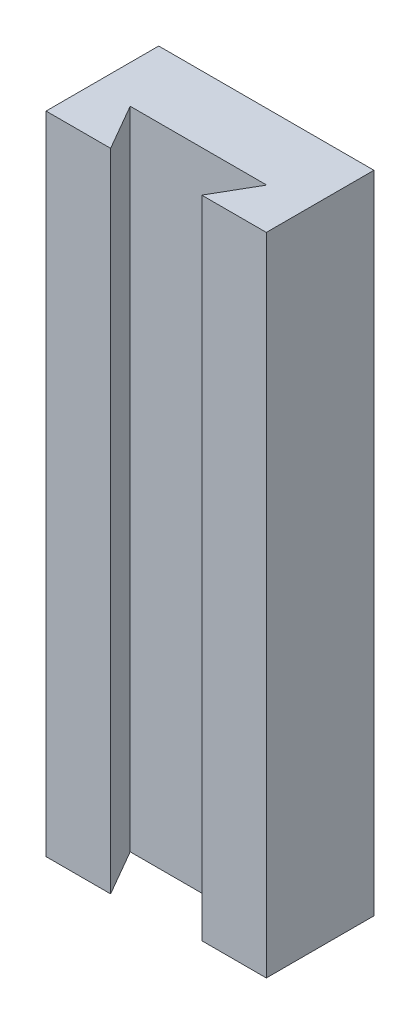
ISO-10303-21;
HEADER;
FILE_DESCRIPTION(('STEP AP214'),'2;1');
FILE_NAME('part.step','',(''),(''),'','','');
FILE_SCHEMA(('AUTOMOTIVE_DESIGN { 1 0 10303 214 1 1 1 1 }'));
ENDSEC;
DATA;
#1=APPLICATION_CONTEXT('core data for automotive mechanical design processes');
#2=APPLICATION_PROTOCOL_DEFINITION('international standard','automotive_design',2000,#1);
#3=PRODUCT_CONTEXT('',#1,'mechanical');
#4=PRODUCT('Part','Part','',(#3));
#5=PRODUCT_RELATED_PRODUCT_CATEGORY('part','',(#4));
#6=PRODUCT_DEFINITION_FORMATION('','',#4);
#7=PRODUCT_DEFINITION_CONTEXT('part definition',#1,'design');
#8=PRODUCT_DEFINITION('design','',#6,#7);
#9=PRODUCT_DEFINITION_SHAPE('','',#8);
#10=(LENGTH_UNIT() NAMED_UNIT(*) SI_UNIT(.MILLI.,.METRE.));
#11=(NAMED_UNIT(*) PLANE_ANGLE_UNIT() SI_UNIT($,.RADIAN.));
#12=(NAMED_UNIT(*) SI_UNIT($,.STERADIAN.) SOLID_ANGLE_UNIT());
#13=UNCERTAINTY_MEASURE_WITH_UNIT(LENGTH_MEASURE(1.E-05),#10,'distance_accuracy_value','');
#14=(GEOMETRIC_REPRESENTATION_CONTEXT(3) GLOBAL_UNCERTAINTY_ASSIGNED_CONTEXT((#13)) GLOBAL_UNIT_ASSIGNED_CONTEXT((#10,
#11,#12)) REPRESENTATION_CONTEXT('',''));
#15=CARTESIAN_POINT('',(0.,0.,0.));
#16=DIRECTION('',(0.,0.,1.));
#17=DIRECTION('',(1.,0.,0.));
#18=AXIS2_PLACEMENT_3D('',#15,#16,#17);
#19=CARTESIAN_POINT('',(-5.,-0.00999999999999959,0.234054964457145));
#20=DIRECTION('',(0.,0.,-1.));
#21=DIRECTION('',(-1.,0.,0.));
#22=AXIS2_PLACEMENT_3D('',#19,#20,#21);
#23=PLANE('',#22);
#24=DIRECTION('',(0.,1.,0.));
#25=VECTOR('',#24,1.);
#26=CARTESIAN_POINT('',(-2.,-0.00999999999999959,0.234054964457145));
#27=LINE('',#26,#25);
#28=CARTESIAN_POINT('',(-2.,0.,0.234054964457145));
#29=VERTEX_POINT('',#28);
#30=CARTESIAN_POINT('',(-2.,30.,0.234054964457145));
#31=VERTEX_POINT('',#30);
#32=EDGE_CURVE('E11',#29,#31,#27,.T.);
#33=ORIENTED_EDGE('',*,*,#32,.T.);
#34=DIRECTION('',(-1.,0.,0.));
#35=VECTOR('',#34,1.);
#36=CARTESIAN_POINT('',(0.,30.,0.234054964457145));
#37=LINE('',#36,#35);
#38=CARTESIAN_POINT('',(-5.,30.,0.234054964457145));
#39=VERTEX_POINT('',#38);
#40=EDGE_CURVE('E150',#31,#39,#37,.T.);
#41=ORIENTED_EDGE('',*,*,#40,.T.);
#42=DIRECTION('',(0.,1.,0.));
#43=VECTOR('',#42,1.);
#44=CARTESIAN_POINT('',(-5.,30.,0.234054964457145));
#45=LINE('',#44,#43);
#46=CARTESIAN_POINT('',(-5.,0.,0.234054964457145));
#47=VERTEX_POINT('',#46);
#48=EDGE_CURVE('E149',#47,#39,#45,.T.);
#49=ORIENTED_EDGE('',*,*,#48,.F.);
#50=DIRECTION('',(-1.,0.,0.));
#51=VECTOR('',#50,1.);
#52=CARTESIAN_POINT('',(0.,0.,0.234054964457145));
#53=LINE('',#52,#51);
#54=EDGE_CURVE('E57',#29,#47,#53,.T.);
#55=ORIENTED_EDGE('',*,*,#54,.F.);
#56=EDGE_LOOP('',(#33,#41,#49,#55));
#57=FACE_BOUND('',#56,.T.);
#58=ADVANCED_FACE('F43',(#57),#23,.F.);
#59=CARTESIAN_POINT('',(-2.,-0.00999999999999959,0.234054964457145));
#60=DIRECTION('',(-0.866025403784436,0.,0.500000000000004));
#61=DIRECTION('',(0.500000000000004,0.,0.866025403784436));
#62=AXIS2_PLACEMENT_3D('',#59,#60,#61);
#63=PLANE('',#62);
#64=DIRECTION('',(0.,1.,0.));
#65=VECTOR('',#64,1.);
#66=CARTESIAN_POINT('',(-3.2399584674678,-0.00999999999999959,-1.9136161004723));
#67=LINE('',#66,#65);
#68=CARTESIAN_POINT('',(-3.2399584674678,0.,-1.9136161004723));
#69=VERTEX_POINT('',#68);
#70=CARTESIAN_POINT('',(-3.2399584674678,30.,-1.9136161004723));
#71=VERTEX_POINT('',#70);
#72=EDGE_CURVE('E51',#69,#71,#67,.T.);
#73=ORIENTED_EDGE('',*,*,#72,.T.);
#74=DIRECTION('',(0.500000000000004,0.,0.866025403784436));
#75=VECTOR('',#74,1.);
#76=CARTESIAN_POINT('',(-1.60134877255087,30.,0.924539144898731));
#77=LINE('',#76,#75);
#78=EDGE_CURVE('E154',#71,#31,#77,.T.);
#79=ORIENTED_EDGE('',*,*,#78,.T.);
#80=ORIENTED_EDGE('',*,*,#32,.F.);
#81=DIRECTION('',(0.500000000000004,0.,0.866025403784436));
#82=VECTOR('',#81,1.);
#83=CARTESIAN_POINT('',(-1.60134877255087,0.,0.924539144898731));
#84=LINE('',#83,#82);
#85=EDGE_CURVE('E64',#69,#29,#84,.T.);
#86=ORIENTED_EDGE('',*,*,#85,.F.);
#87=EDGE_LOOP('',(#73,#79,#80,#86));
#88=FACE_BOUND('',#87,.T.);
#89=ADVANCED_FACE('F172',(#88),#63,.F.);
#90=CARTESIAN_POINT('',(-3.2399584674678,-0.00999999999999959,-1.9136161004723));
#91=DIRECTION('',(0.,0.,-1.));
#92=DIRECTION('',(-1.,0.,0.));
#93=AXIS2_PLACEMENT_3D('',#90,#91,#92);
#94=PLANE('',#93);
#95=DIRECTION('',(0.,1.,0.));
#96=VECTOR('',#95,1.);
#97=CARTESIAN_POINT('',(3.1048267707333,-0.00999999999999959,-1.9136161004723));
#98=LINE('',#97,#96);
#99=CARTESIAN_POINT('',(3.1048267707333,0.,-1.9136161004723));
#100=VERTEX_POINT('',#99);
#101=CARTESIAN_POINT('',(3.1048267707333,30.,-1.9136161004723));
#102=VERTEX_POINT('',#101);
#103=EDGE_CURVE('E169',#100,#102,#98,.T.);
#104=ORIENTED_EDGE('',*,*,#103,.T.);
#105=DIRECTION('',(-1.,0.,0.));
#106=VECTOR('',#105,1.);
#107=CARTESIAN_POINT('',(0.,30.,-1.9136161004723));
#108=LINE('',#107,#106);
#109=EDGE_CURVE('E157',#102,#71,#108,.T.);
#110=ORIENTED_EDGE('',*,*,#109,.T.);
#111=ORIENTED_EDGE('',*,*,#72,.F.);
#112=DIRECTION('',(-1.,0.,0.));
#113=VECTOR('',#112,1.);
#114=CARTESIAN_POINT('',(0.,0.,-1.9136161004723));
#115=LINE('',#114,#113);
#116=EDGE_CURVE('E141',#100,#69,#115,.T.);
#117=ORIENTED_EDGE('',*,*,#116,.F.);
#118=EDGE_LOOP('',(#104,#110,#111,#117));
#119=FACE_BOUND('',#118,.T.);
#120=ADVANCED_FACE('F174',(#119),#94,.F.);
#121=CARTESIAN_POINT('',(3.1048267707333,-0.00999999999999959,-1.9136161004723));
#122=DIRECTION('',(0.866025403784436,0.,0.500000000000004));
#123=DIRECTION('',(0.500000000000004,0.,-0.866025403784436));
#124=AXIS2_PLACEMENT_3D('',#121,#122,#123);
#125=PLANE('',#124);
#126=DIRECTION('',(0.,1.,0.));
#127=VECTOR('',#126,1.);
#128=CARTESIAN_POINT('',(2.,-0.00999999999999959,0.));
#129=LINE('',#128,#127);
#130=CARTESIAN_POINT('',(2.,0.,0.));
#131=VERTEX_POINT('',#130);
#132=CARTESIAN_POINT('',(2.,30.,0.));
#133=VERTEX_POINT('',#132);
#134=EDGE_CURVE('E153',#131,#133,#129,.T.);
#135=ORIENTED_EDGE('',*,*,#134,.T.);
#136=DIRECTION('',(0.500000000000004,0.,-0.866025403784436));
#137=VECTOR('',#136,1.);
#138=CARTESIAN_POINT('',(1.49999999999999,30.,0.866025403784443));
#139=LINE('',#138,#137);
#140=EDGE_CURVE('E160',#133,#102,#139,.T.);
#141=ORIENTED_EDGE('',*,*,#140,.T.);
#142=ORIENTED_EDGE('',*,*,#103,.F.);
#143=DIRECTION('',(0.500000000000004,0.,-0.866025403784436));
#144=VECTOR('',#143,1.);
#145=CARTESIAN_POINT('',(1.49999999999999,0.,0.866025403784443));
#146=LINE('',#145,#144);
#147=EDGE_CURVE('E143',#131,#100,#146,.T.);
#148=ORIENTED_EDGE('',*,*,#147,.F.);
#149=EDGE_LOOP('',(#135,#141,#142,#148));
#150=FACE_BOUND('',#149,.T.);
#151=ADVANCED_FACE('F187',(#150),#125,.F.);
#152=CARTESIAN_POINT('',(2.,-0.00999999999999959,0.));
#153=DIRECTION('',(0.,0.,-1.));
#154=DIRECTION('',(-1.,0.,0.));
#155=AXIS2_PLACEMENT_3D('',#152,#153,#154);
#156=PLANE('',#155);
#157=DIRECTION('',(0.,-1.,0.));
#158=VECTOR('',#157,1.);
#159=CARTESIAN_POINT('',(5.,30.,0.));
#160=LINE('',#159,#158);
#161=CARTESIAN_POINT('',(5.,30.,0.));
#162=VERTEX_POINT('',#161);
#163=CARTESIAN_POINT('',(5.,0.,0.));
#164=VERTEX_POINT('',#163);
#165=EDGE_CURVE('E164',#162,#164,#160,.T.);
#166=ORIENTED_EDGE('',*,*,#165,.F.);
#167=DIRECTION('',(-1.,0.,0.));
#168=VECTOR('',#167,1.);
#169=CARTESIAN_POINT('',(0.,30.,0.));
#170=LINE('',#169,#168);
#171=EDGE_CURVE('E115',#162,#133,#170,.T.);
#172=ORIENTED_EDGE('',*,*,#171,.T.);
#173=ORIENTED_EDGE('',*,*,#134,.F.);
#174=DIRECTION('',(-1.,0.,0.));
#175=VECTOR('',#174,1.);
#176=CARTESIAN_POINT('',(0.,0.,0.));
#177=LINE('',#176,#175);
#178=EDGE_CURVE('E146',#164,#131,#177,.T.);
#179=ORIENTED_EDGE('',*,*,#178,.F.);
#180=EDGE_LOOP('',(#166,#172,#173,#179));
#181=FACE_BOUND('',#180,.T.);
#182=ADVANCED_FACE('F45',(#181),#156,.F.);
#183=CARTESIAN_POINT('',(-5.,30.,-5.));
#184=DIRECTION('',(0.,0.,1.));
#185=DIRECTION('',(1.,0.,0.));
#186=AXIS2_PLACEMENT_3D('',#183,#184,#185);
#187=PLANE('',#186);
#188=DIRECTION('',(-1.,0.,0.));
#189=VECTOR('',#188,1.);
#190=CARTESIAN_POINT('',(-5.,0.,-5.));
#191=LINE('',#190,#189);
#192=CARTESIAN_POINT('',(5.,0.,-5.));
#193=VERTEX_POINT('',#192);
#194=CARTESIAN_POINT('',(-5.,0.,-5.));
#195=VERTEX_POINT('',#194);
#196=EDGE_CURVE('E198',#193,#195,#191,.T.);
#197=ORIENTED_EDGE('',*,*,#196,.T.);
#198=DIRECTION('',(0.,-1.,0.));
#199=VECTOR('',#198,1.);
#200=CARTESIAN_POINT('',(-5.,30.,-5.));
#201=LINE('',#200,#199);
#202=CARTESIAN_POINT('',(-5.,30.,-5.));
#203=VERTEX_POINT('',#202);
#204=EDGE_CURVE('E127',#203,#195,#201,.T.);
#205=ORIENTED_EDGE('',*,*,#204,.F.);
#206=DIRECTION('',(-1.,0.,0.));
#207=VECTOR('',#206,1.);
#208=CARTESIAN_POINT('',(-5.,30.,-5.));
#209=LINE('',#208,#207);
#210=CARTESIAN_POINT('',(5.,30.,-5.));
#211=VERTEX_POINT('',#210);
#212=EDGE_CURVE('E112',#211,#203,#209,.T.);
#213=ORIENTED_EDGE('',*,*,#212,.F.);
#214=DIRECTION('',(0.,-1.,0.));
#215=VECTOR('',#214,1.);
#216=CARTESIAN_POINT('',(5.,30.,-5.));
#217=LINE('',#216,#215);
#218=EDGE_CURVE('E125',#211,#193,#217,.T.);
#219=ORIENTED_EDGE('',*,*,#218,.T.);
#220=EDGE_LOOP('',(#197,#205,#213,#219));
#221=FACE_BOUND('',#220,.T.);
#222=ADVANCED_FACE('F124',(#221),#187,.F.);
#223=CARTESIAN_POINT('',(-5.,30.,-5.));
#224=DIRECTION('',(1.,0.,0.));
#225=DIRECTION('',(0.,0.,-1.));
#226=AXIS2_PLACEMENT_3D('',#223,#224,#225);
#227=PLANE('',#226);
#228=DIRECTION('',(0.,0.,1.));
#229=VECTOR('',#228,1.);
#230=CARTESIAN_POINT('',(-5.,0.,-5.));
#231=LINE('',#230,#229);
#232=EDGE_CURVE('E120',#195,#47,#231,.T.);
#233=ORIENTED_EDGE('',*,*,#232,.T.);
#234=ORIENTED_EDGE('',*,*,#48,.T.);
#235=DIRECTION('',(0.,0.,1.));
#236=VECTOR('',#235,1.);
#237=CARTESIAN_POINT('',(-5.,30.,-5.));
#238=LINE('',#237,#236);
#239=EDGE_CURVE('E129',#203,#39,#238,.T.);
#240=ORIENTED_EDGE('',*,*,#239,.F.);
#241=ORIENTED_EDGE('',*,*,#204,.T.);
#242=EDGE_LOOP('',(#233,#234,#240,#241));
#243=FACE_BOUND('',#242,.T.);
#244=ADVANCED_FACE('F204',(#243),#227,.F.);
#245=CARTESIAN_POINT('',(5.,30.,-5.));
#246=DIRECTION('',(-1.,0.,0.));
#247=DIRECTION('',(0.,0.,1.));
#248=AXIS2_PLACEMENT_3D('',#245,#246,#247);
#249=PLANE('',#248);
#250=DIRECTION('',(0.,0.,-1.));
#251=VECTOR('',#250,1.);
#252=CARTESIAN_POINT('',(5.,30.,-5.));
#253=LINE('',#252,#251);
#254=EDGE_CURVE('E108',#162,#211,#253,.T.);
#255=ORIENTED_EDGE('',*,*,#254,.F.);
#256=ORIENTED_EDGE('',*,*,#165,.T.);
#257=DIRECTION('',(0.,0.,-1.));
#258=VECTOR('',#257,1.);
#259=CARTESIAN_POINT('',(5.,0.,-5.));
#260=LINE('',#259,#258);
#261=EDGE_CURVE('E133',#164,#193,#260,.T.);
#262=ORIENTED_EDGE('',*,*,#261,.T.);
#263=ORIENTED_EDGE('',*,*,#218,.F.);
#264=EDGE_LOOP('',(#255,#256,#262,#263));
#265=FACE_BOUND('',#264,.T.);
#266=ADVANCED_FACE('F131',(#265),#249,.F.);
#267=CARTESIAN_POINT('',(0.,0.,0.));
#268=DIRECTION('',(0.,1.,0.));
#269=DIRECTION('',(0.,0.,1.));
#270=AXIS2_PLACEMENT_3D('',#267,#268,#269);
#271=PLANE('',#270);
#272=ORIENTED_EDGE('',*,*,#261,.F.);
#273=ORIENTED_EDGE('',*,*,#178,.T.);
#274=ORIENTED_EDGE('',*,*,#147,.T.);
#275=ORIENTED_EDGE('',*,*,#116,.T.);
#276=ORIENTED_EDGE('',*,*,#85,.T.);
#277=ORIENTED_EDGE('',*,*,#54,.T.);
#278=ORIENTED_EDGE('',*,*,#232,.F.);
#279=ORIENTED_EDGE('',*,*,#196,.F.);
#280=EDGE_LOOP('',(#272,#273,#274,#275,#276,#277,#278,#279));
#281=FACE_BOUND('',#280,.T.);
#282=ADVANCED_FACE('F196',(#281),#271,.F.);
#283=CARTESIAN_POINT('',(0.,30.,0.));
#284=DIRECTION('',(0.,1.,0.));
#285=DIRECTION('',(0.,0.,1.));
#286=AXIS2_PLACEMENT_3D('',#283,#284,#285);
#287=PLANE('',#286);
#288=ORIENTED_EDGE('',*,*,#171,.F.);
#289=ORIENTED_EDGE('',*,*,#254,.T.);
#290=ORIENTED_EDGE('',*,*,#212,.T.);
#291=ORIENTED_EDGE('',*,*,#239,.T.);
#292=ORIENTED_EDGE('',*,*,#40,.F.);
#293=ORIENTED_EDGE('',*,*,#78,.F.);
#294=ORIENTED_EDGE('',*,*,#109,.F.);
#295=ORIENTED_EDGE('',*,*,#140,.F.);
#296=EDGE_LOOP('',(#288,#289,#290,#291,#292,#293,#294,#295));
#297=FACE_BOUND('',#296,.T.);
#298=ADVANCED_FACE('F110',(#297),#287,.T.);
#299=CLOSED_SHELL('',(#58,#89,#120,#151,#182,#222,#244,#266,#282,#298));
#300=MANIFOLD_SOLID_BREP('B2',#299);
#301=ADVANCED_BREP_SHAPE_REPRESENTATION('',(#18,#300),#14);
#302=SHAPE_DEFINITION_REPRESENTATION(#9,#301);
ENDSEC;
END-ISO-10303-21;
